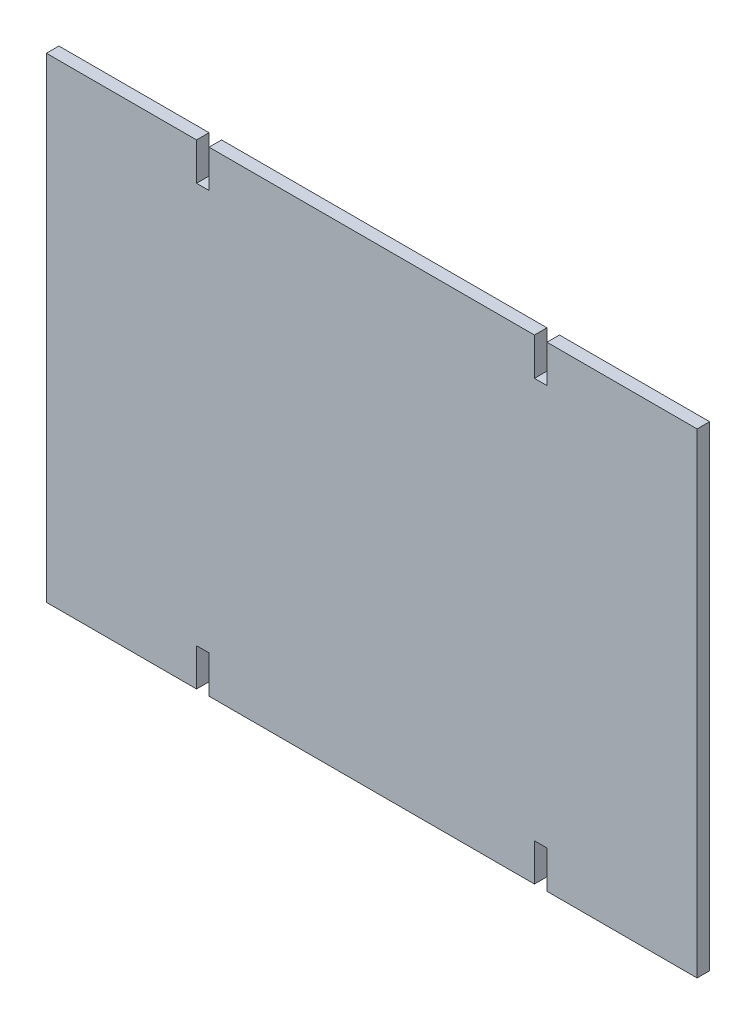
ISO-10303-21;
HEADER;
FILE_DESCRIPTION(('STEP AP214'),'2;1');
FILE_NAME('part.step','',(''),(''),'','','');
FILE_SCHEMA(('AUTOMOTIVE_DESIGN { 1 0 10303 214 1 1 1 1 }'));
ENDSEC;
DATA;
#1=APPLICATION_CONTEXT('core data for automotive mechanical design processes');
#2=APPLICATION_PROTOCOL_DEFINITION('international standard','automotive_design',2000,#1);
#3=PRODUCT_CONTEXT('',#1,'mechanical');
#4=PRODUCT('Part','Part','',(#3));
#5=PRODUCT_RELATED_PRODUCT_CATEGORY('part','',(#4));
#6=PRODUCT_DEFINITION_FORMATION('','',#4);
#7=PRODUCT_DEFINITION_CONTEXT('part definition',#1,'design');
#8=PRODUCT_DEFINITION('design','',#6,#7);
#9=PRODUCT_DEFINITION_SHAPE('','',#8);
#10=(LENGTH_UNIT() NAMED_UNIT(*) SI_UNIT(.MILLI.,.METRE.));
#11=(NAMED_UNIT(*) PLANE_ANGLE_UNIT() SI_UNIT($,.RADIAN.));
#12=(NAMED_UNIT(*) SI_UNIT($,.STERADIAN.) SOLID_ANGLE_UNIT());
#13=UNCERTAINTY_MEASURE_WITH_UNIT(LENGTH_MEASURE(1.E-05),#10,'distance_accuracy_value','');
#14=(GEOMETRIC_REPRESENTATION_CONTEXT(3) GLOBAL_UNCERTAINTY_ASSIGNED_CONTEXT((#13)) GLOBAL_UNIT_ASSIGNED_CONTEXT((#10,
#11,#12)) REPRESENTATION_CONTEXT('',''));
#15=CARTESIAN_POINT('',(0.,0.,0.));
#16=DIRECTION('',(0.,0.,1.));
#17=DIRECTION('',(1.,0.,0.));
#18=AXIS2_PLACEMENT_3D('',#15,#16,#17);
#19=CARTESIAN_POINT('',(0.,-190.,5.));
#20=DIRECTION('',(0.,1.,0.));
#21=DIRECTION('',(0.,0.,1.));
#22=AXIS2_PLACEMENT_3D('',#19,#20,#21);
#23=PLANE('',#22);
#24=DIRECTION('',(1.,0.,0.));
#25=VECTOR('',#24,1.);
#26=CARTESIAN_POINT('',(0.,-190.,5.));
#27=LINE('',#26,#25);
#28=CARTESIAN_POINT('',(200.,-190.,5.));
#29=VERTEX_POINT('',#28);
#30=CARTESIAN_POINT('',(260.,-190.,5.));
#31=VERTEX_POINT('',#30);
#32=EDGE_CURVE('E286',#29,#31,#27,.T.);
#33=ORIENTED_EDGE('',*,*,#32,.F.);
#34=DIRECTION('',(0.,0.,-1.));
#35=VECTOR('',#34,1.);
#36=CARTESIAN_POINT('',(200.,-190.,5.));
#37=LINE('',#36,#35);
#38=CARTESIAN_POINT('',(200.,-190.,0.));
#39=VERTEX_POINT('',#38);
#40=EDGE_CURVE('E227',#29,#39,#37,.T.);
#41=ORIENTED_EDGE('',*,*,#40,.T.);
#42=DIRECTION('',(1.,0.,0.));
#43=VECTOR('',#42,1.);
#44=CARTESIAN_POINT('',(0.,-190.,0.));
#45=LINE('',#44,#43);
#46=CARTESIAN_POINT('',(260.,-190.,0.));
#47=VERTEX_POINT('',#46);
#48=EDGE_CURVE('E300',#39,#47,#45,.T.);
#49=ORIENTED_EDGE('',*,*,#48,.T.);
#50=DIRECTION('',(0.,0.,-1.));
#51=VECTOR('',#50,1.);
#52=CARTESIAN_POINT('',(260.,-190.,5.));
#53=LINE('',#52,#51);
#54=EDGE_CURVE('E44',#31,#47,#53,.T.);
#55=ORIENTED_EDGE('',*,*,#54,.F.);
#56=EDGE_LOOP('',(#33,#41,#49,#55));
#57=FACE_BOUND('',#56,.T.);
#58=ADVANCED_FACE('F36',(#57),#23,.F.);
#59=CARTESIAN_POINT('',(0.,-190.,0.));
#60=VERTEX_POINT('',#59);
#61=CARTESIAN_POINT('',(60.,-190.,0.));
#62=VERTEX_POINT('',#61);
#63=EDGE_CURVE('E301',#60,#62,#45,.T.);
#64=ORIENTED_EDGE('',*,*,#63,.T.);
#65=DIRECTION('',(0.,0.,-1.));
#66=VECTOR('',#65,1.);
#67=CARTESIAN_POINT('',(60.,-190.,5.));
#68=LINE('',#67,#66);
#69=CARTESIAN_POINT('',(60.,-190.,5.));
#70=VERTEX_POINT('',#69);
#71=EDGE_CURVE('E202',#70,#62,#68,.T.);
#72=ORIENTED_EDGE('',*,*,#71,.F.);
#73=CARTESIAN_POINT('',(0.,-190.,5.));
#74=VERTEX_POINT('',#73);
#75=EDGE_CURVE('E193',#74,#70,#27,.T.);
#76=ORIENTED_EDGE('',*,*,#75,.F.);
#77=DIRECTION('',(0.,0.,-1.));
#78=VECTOR('',#77,1.);
#79=CARTESIAN_POINT('',(0.,-190.,5.));
#80=LINE('',#79,#78);
#81=EDGE_CURVE('E11',#74,#60,#80,.T.);
#82=ORIENTED_EDGE('',*,*,#81,.T.);
#83=EDGE_LOOP('',(#64,#72,#76,#82));
#84=FACE_BOUND('',#83,.T.);
#85=ADVANCED_FACE('F353',(#84),#23,.F.);
#86=CARTESIAN_POINT('',(0.,0.,5.));
#87=DIRECTION('',(0.,-1.,0.));
#88=DIRECTION('',(0.,0.,-1.));
#89=AXIS2_PLACEMENT_3D('',#86,#87,#88);
#90=PLANE('',#89);
#91=DIRECTION('',(-1.,0.,0.));
#92=VECTOR('',#91,1.);
#93=CARTESIAN_POINT('',(0.,0.,5.));
#94=LINE('',#93,#92);
#95=CARTESIAN_POINT('',(60.,0.,5.));
#96=VERTEX_POINT('',#95);
#97=CARTESIAN_POINT('',(0.,0.,5.));
#98=VERTEX_POINT('',#97);
#99=EDGE_CURVE('E292',#96,#98,#94,.T.);
#100=ORIENTED_EDGE('',*,*,#99,.F.);
#101=DIRECTION('',(0.,0.,-1.));
#102=VECTOR('',#101,1.);
#103=CARTESIAN_POINT('',(60.,0.,5.));
#104=LINE('',#103,#102);
#105=CARTESIAN_POINT('',(60.,0.,0.));
#106=VERTEX_POINT('',#105);
#107=EDGE_CURVE('E223',#96,#106,#104,.T.);
#108=ORIENTED_EDGE('',*,*,#107,.T.);
#109=DIRECTION('',(-1.,0.,0.));
#110=VECTOR('',#109,1.);
#111=CARTESIAN_POINT('',(0.,0.,0.));
#112=LINE('',#111,#110);
#113=CARTESIAN_POINT('',(0.,0.,0.));
#114=VERTEX_POINT('',#113);
#115=EDGE_CURVE('E307',#106,#114,#112,.T.);
#116=ORIENTED_EDGE('',*,*,#115,.T.);
#117=DIRECTION('',(0.,0.,-1.));
#118=VECTOR('',#117,1.);
#119=CARTESIAN_POINT('',(0.,0.,5.));
#120=LINE('',#119,#118);
#121=EDGE_CURVE('E296',#98,#114,#120,.T.);
#122=ORIENTED_EDGE('',*,*,#121,.F.);
#123=EDGE_LOOP('',(#100,#108,#116,#122));
#124=FACE_BOUND('',#123,.T.);
#125=ADVANCED_FACE('F357',(#124),#90,.F.);
#126=CARTESIAN_POINT('',(260.,0.,0.));
#127=VERTEX_POINT('',#126);
#128=CARTESIAN_POINT('',(200.,0.,0.));
#129=VERTEX_POINT('',#128);
#130=EDGE_CURVE('E287',#127,#129,#112,.T.);
#131=ORIENTED_EDGE('',*,*,#130,.T.);
#132=DIRECTION('',(0.,0.,-1.));
#133=VECTOR('',#132,1.);
#134=CARTESIAN_POINT('',(200.,0.,5.));
#135=LINE('',#134,#133);
#136=CARTESIAN_POINT('',(200.,0.,5.));
#137=VERTEX_POINT('',#136);
#138=EDGE_CURVE('E275',#137,#129,#135,.T.);
#139=ORIENTED_EDGE('',*,*,#138,.F.);
#140=CARTESIAN_POINT('',(260.,0.,5.));
#141=VERTEX_POINT('',#140);
#142=EDGE_CURVE('E293',#141,#137,#94,.T.);
#143=ORIENTED_EDGE('',*,*,#142,.F.);
#144=DIRECTION('',(0.,0.,-1.));
#145=VECTOR('',#144,1.);
#146=CARTESIAN_POINT('',(260.,0.,5.));
#147=LINE('',#146,#145);
#148=EDGE_CURVE('E313',#141,#127,#147,.T.);
#149=ORIENTED_EDGE('',*,*,#148,.T.);
#150=EDGE_LOOP('',(#131,#139,#143,#149));
#151=FACE_BOUND('',#150,.T.);
#152=ADVANCED_FACE('F332',(#151),#90,.F.);
#153=CARTESIAN_POINT('',(0.,0.,5.));
#154=DIRECTION('',(1.,0.,0.));
#155=DIRECTION('',(0.,0.,-1.));
#156=AXIS2_PLACEMENT_3D('',#153,#154,#155);
#157=PLANE('',#156);
#158=DIRECTION('',(0.,-1.,0.));
#159=VECTOR('',#158,1.);
#160=CARTESIAN_POINT('',(0.,0.,0.));
#161=LINE('',#160,#159);
#162=EDGE_CURVE('E277',#114,#60,#161,.T.);
#163=ORIENTED_EDGE('',*,*,#162,.T.);
#164=ORIENTED_EDGE('',*,*,#81,.F.);
#165=DIRECTION('',(0.,-1.,0.));
#166=VECTOR('',#165,1.);
#167=CARTESIAN_POINT('',(0.,0.,5.));
#168=LINE('',#167,#166);
#169=EDGE_CURVE('E284',#98,#74,#168,.T.);
#170=ORIENTED_EDGE('',*,*,#169,.F.);
#171=ORIENTED_EDGE('',*,*,#121,.T.);
#172=EDGE_LOOP('',(#163,#164,#170,#171));
#173=FACE_BOUND('',#172,.T.);
#174=ADVANCED_FACE('F38',(#173),#157,.F.);
#175=CARTESIAN_POINT('',(65.,-190.,0.));
#176=VERTEX_POINT('',#175);
#177=CARTESIAN_POINT('',(195.,-190.,0.));
#178=VERTEX_POINT('',#177);
#179=EDGE_CURVE('E305',#176,#178,#45,.T.);
#180=ORIENTED_EDGE('',*,*,#179,.T.);
#181=DIRECTION('',(0.,0.,-1.));
#182=VECTOR('',#181,1.);
#183=CARTESIAN_POINT('',(195.,-190.,5.));
#184=LINE('',#183,#182);
#185=CARTESIAN_POINT('',(195.,-190.,5.));
#186=VERTEX_POINT('',#185);
#187=EDGE_CURVE('E218',#186,#178,#184,.T.);
#188=ORIENTED_EDGE('',*,*,#187,.F.);
#189=CARTESIAN_POINT('',(65.,-190.,5.));
#190=VERTEX_POINT('',#189);
#191=EDGE_CURVE('E290',#190,#186,#27,.T.);
#192=ORIENTED_EDGE('',*,*,#191,.F.);
#193=DIRECTION('',(0.,0.,-1.));
#194=VECTOR('',#193,1.);
#195=CARTESIAN_POINT('',(65.,-190.,5.));
#196=LINE('',#195,#194);
#197=EDGE_CURVE('E205',#190,#176,#196,.T.);
#198=ORIENTED_EDGE('',*,*,#197,.T.);
#199=EDGE_LOOP('',(#180,#188,#192,#198));
#200=FACE_BOUND('',#199,.T.);
#201=ADVANCED_FACE('F340',(#200),#23,.F.);
#202=CARTESIAN_POINT('',(260.,0.,5.));
#203=DIRECTION('',(-1.,0.,0.));
#204=DIRECTION('',(0.,0.,1.));
#205=AXIS2_PLACEMENT_3D('',#202,#203,#204);
#206=PLANE('',#205);
#207=DIRECTION('',(0.,1.,0.));
#208=VECTOR('',#207,1.);
#209=CARTESIAN_POINT('',(260.,0.,0.));
#210=LINE('',#209,#208);
#211=EDGE_CURVE('E304',#47,#127,#210,.T.);
#212=ORIENTED_EDGE('',*,*,#211,.T.);
#213=ORIENTED_EDGE('',*,*,#148,.F.);
#214=DIRECTION('',(0.,1.,0.));
#215=VECTOR('',#214,1.);
#216=CARTESIAN_POINT('',(260.,0.,5.));
#217=LINE('',#216,#215);
#218=EDGE_CURVE('E289',#31,#141,#217,.T.);
#219=ORIENTED_EDGE('',*,*,#218,.F.);
#220=ORIENTED_EDGE('',*,*,#54,.T.);
#221=EDGE_LOOP('',(#212,#213,#219,#220));
#222=FACE_BOUND('',#221,.T.);
#223=ADVANCED_FACE('F320',(#222),#206,.F.);
#224=CARTESIAN_POINT('',(195.,0.,0.));
#225=VERTEX_POINT('',#224);
#226=CARTESIAN_POINT('',(65.,0.,0.));
#227=VERTEX_POINT('',#226);
#228=EDGE_CURVE('E310',#225,#227,#112,.T.);
#229=ORIENTED_EDGE('',*,*,#228,.T.);
#230=DIRECTION('',(0.,0.,-1.));
#231=VECTOR('',#230,1.);
#232=CARTESIAN_POINT('',(65.,0.,5.));
#233=LINE('',#232,#231);
#234=CARTESIAN_POINT('',(65.,0.,5.));
#235=VERTEX_POINT('',#234);
#236=EDGE_CURVE('E245',#235,#227,#233,.T.);
#237=ORIENTED_EDGE('',*,*,#236,.F.);
#238=CARTESIAN_POINT('',(195.,0.,5.));
#239=VERTEX_POINT('',#238);
#240=EDGE_CURVE('E297',#239,#235,#94,.T.);
#241=ORIENTED_EDGE('',*,*,#240,.F.);
#242=DIRECTION('',(0.,0.,-1.));
#243=VECTOR('',#242,1.);
#244=CARTESIAN_POINT('',(195.,0.,5.));
#245=LINE('',#244,#243);
#246=EDGE_CURVE('E278',#239,#225,#245,.T.);
#247=ORIENTED_EDGE('',*,*,#246,.T.);
#248=EDGE_LOOP('',(#229,#237,#241,#247));
#249=FACE_BOUND('',#248,.T.);
#250=ADVANCED_FACE('F365',(#249),#90,.F.);
#251=CARTESIAN_POINT('',(0.,0.,5.));
#252=DIRECTION('',(0.,0.,1.));
#253=DIRECTION('',(1.,0.,0.));
#254=AXIS2_PLACEMENT_3D('',#251,#252,#253);
#255=PLANE('',#254);
#256=DIRECTION('',(0.,-1.,0.));
#257=VECTOR('',#256,1.);
#258=CARTESIAN_POINT('',(200.,-190.,5.));
#259=LINE('',#258,#257);
#260=CARTESIAN_POINT('',(200.,-175.,5.));
#261=VERTEX_POINT('',#260);
#262=EDGE_CURVE('E216',#261,#29,#259,.T.);
#263=ORIENTED_EDGE('',*,*,#262,.T.);
#264=ORIENTED_EDGE('',*,*,#32,.T.);
#265=ORIENTED_EDGE('',*,*,#218,.T.);
#266=ORIENTED_EDGE('',*,*,#142,.T.);
#267=DIRECTION('',(0.,-1.,0.));
#268=VECTOR('',#267,1.);
#269=CARTESIAN_POINT('',(200.,0.,5.));
#270=LINE('',#269,#268);
#271=CARTESIAN_POINT('',(200.,-15.,5.));
#272=VERTEX_POINT('',#271);
#273=EDGE_CURVE('E259',#137,#272,#270,.T.);
#274=ORIENTED_EDGE('',*,*,#273,.T.);
#275=DIRECTION('',(-1.,0.,0.));
#276=VECTOR('',#275,1.);
#277=CARTESIAN_POINT('',(200.,-15.,5.));
#278=LINE('',#277,#276);
#279=CARTESIAN_POINT('',(195.,-15.,5.));
#280=VERTEX_POINT('',#279);
#281=EDGE_CURVE('E262',#272,#280,#278,.T.);
#282=ORIENTED_EDGE('',*,*,#281,.T.);
#283=DIRECTION('',(0.,1.,0.));
#284=VECTOR('',#283,1.);
#285=CARTESIAN_POINT('',(195.,0.,5.));
#286=LINE('',#285,#284);
#287=EDGE_CURVE('E266',#280,#239,#286,.T.);
#288=ORIENTED_EDGE('',*,*,#287,.T.);
#289=ORIENTED_EDGE('',*,*,#240,.T.);
#290=DIRECTION('',(0.,-1.,0.));
#291=VECTOR('',#290,1.);
#292=CARTESIAN_POINT('',(65.,0.,5.));
#293=LINE('',#292,#291);
#294=CARTESIAN_POINT('',(65.,-15.,5.));
#295=VERTEX_POINT('',#294);
#296=EDGE_CURVE('E235',#235,#295,#293,.T.);
#297=ORIENTED_EDGE('',*,*,#296,.T.);
#298=DIRECTION('',(-1.,0.,0.));
#299=VECTOR('',#298,1.);
#300=CARTESIAN_POINT('',(60.,-15.,5.));
#301=LINE('',#300,#299);
#302=CARTESIAN_POINT('',(60.,-15.,5.));
#303=VERTEX_POINT('',#302);
#304=EDGE_CURVE('E238',#295,#303,#301,.T.);
#305=ORIENTED_EDGE('',*,*,#304,.T.);
#306=DIRECTION('',(0.,1.,0.));
#307=VECTOR('',#306,1.);
#308=CARTESIAN_POINT('',(60.,0.,5.));
#309=LINE('',#308,#307);
#310=EDGE_CURVE('E242',#303,#96,#309,.T.);
#311=ORIENTED_EDGE('',*,*,#310,.T.);
#312=ORIENTED_EDGE('',*,*,#99,.T.);
#313=ORIENTED_EDGE('',*,*,#169,.T.);
#314=ORIENTED_EDGE('',*,*,#75,.T.);
#315=DIRECTION('',(0.,1.,0.));
#316=VECTOR('',#315,1.);
#317=CARTESIAN_POINT('',(60.,-190.,5.));
#318=LINE('',#317,#316);
#319=CARTESIAN_POINT('',(60.,-175.,5.));
#320=VERTEX_POINT('',#319);
#321=EDGE_CURVE('E174',#70,#320,#318,.T.);
#322=ORIENTED_EDGE('',*,*,#321,.T.);
#323=DIRECTION('',(1.,0.,0.));
#324=VECTOR('',#323,1.);
#325=CARTESIAN_POINT('',(60.,-175.,5.));
#326=LINE('',#325,#324);
#327=CARTESIAN_POINT('',(65.,-175.,5.));
#328=VERTEX_POINT('',#327);
#329=EDGE_CURVE('E183',#320,#328,#326,.T.);
#330=ORIENTED_EDGE('',*,*,#329,.T.);
#331=DIRECTION('',(0.,-1.,0.));
#332=VECTOR('',#331,1.);
#333=CARTESIAN_POINT('',(65.,-190.,5.));
#334=LINE('',#333,#332);
#335=EDGE_CURVE('E180',#328,#190,#334,.T.);
#336=ORIENTED_EDGE('',*,*,#335,.T.);
#337=ORIENTED_EDGE('',*,*,#191,.T.);
#338=DIRECTION('',(0.,1.,0.));
#339=VECTOR('',#338,1.);
#340=CARTESIAN_POINT('',(195.,-190.,5.));
#341=LINE('',#340,#339);
#342=CARTESIAN_POINT('',(195.,-175.,5.));
#343=VERTEX_POINT('',#342);
#344=EDGE_CURVE('E209',#186,#343,#341,.T.);
#345=ORIENTED_EDGE('',*,*,#344,.T.);
#346=DIRECTION('',(1.,0.,0.));
#347=VECTOR('',#346,1.);
#348=CARTESIAN_POINT('',(200.,-175.,5.));
#349=LINE('',#348,#347);
#350=EDGE_CURVE('E212',#343,#261,#349,.T.);
#351=ORIENTED_EDGE('',*,*,#350,.T.);
#352=EDGE_LOOP('',(#263,#264,#265,#266,#274,#282,#288,#289,#297,#305,#311,#312,#313,#314,#322,
#330,#336,#337,#345,#351));
#353=FACE_BOUND('',#352,.T.);
#354=ADVANCED_FACE('F191',(#353),#255,.T.);
#355=CARTESIAN_POINT('',(0.,0.,0.));
#356=DIRECTION('',(0.,0.,1.));
#357=DIRECTION('',(1.,0.,0.));
#358=AXIS2_PLACEMENT_3D('',#355,#356,#357);
#359=PLANE('',#358);
#360=ORIENTED_EDGE('',*,*,#48,.F.);
#361=DIRECTION('',(0.,-1.,0.));
#362=VECTOR('',#361,1.);
#363=CARTESIAN_POINT('',(200.,-190.,0.));
#364=LINE('',#363,#362);
#365=CARTESIAN_POINT('',(200.,-175.,0.));
#366=VERTEX_POINT('',#365);
#367=EDGE_CURVE('E213',#366,#39,#364,.T.);
#368=ORIENTED_EDGE('',*,*,#367,.F.);
#369=DIRECTION('',(1.,0.,0.));
#370=VECTOR('',#369,1.);
#371=CARTESIAN_POINT('',(200.,-175.,0.));
#372=LINE('',#371,#370);
#373=CARTESIAN_POINT('',(195.,-175.,0.));
#374=VERTEX_POINT('',#373);
#375=EDGE_CURVE('E222',#374,#366,#372,.T.);
#376=ORIENTED_EDGE('',*,*,#375,.F.);
#377=DIRECTION('',(0.,1.,0.));
#378=VECTOR('',#377,1.);
#379=CARTESIAN_POINT('',(195.,-190.,0.));
#380=LINE('',#379,#378);
#381=EDGE_CURVE('E219',#178,#374,#380,.T.);
#382=ORIENTED_EDGE('',*,*,#381,.F.);
#383=ORIENTED_EDGE('',*,*,#179,.F.);
#384=DIRECTION('',(0.,-1.,0.));
#385=VECTOR('',#384,1.);
#386=CARTESIAN_POINT('',(65.,-190.,0.));
#387=LINE('',#386,#385);
#388=CARTESIAN_POINT('',(65.,-175.,0.));
#389=VERTEX_POINT('',#388);
#390=EDGE_CURVE('E194',#389,#176,#387,.T.);
#391=ORIENTED_EDGE('',*,*,#390,.F.);
#392=DIRECTION('',(1.,0.,0.));
#393=VECTOR('',#392,1.);
#394=CARTESIAN_POINT('',(60.,-175.,0.));
#395=LINE('',#394,#393);
#396=CARTESIAN_POINT('',(60.,-175.,0.));
#397=VERTEX_POINT('',#396);
#398=EDGE_CURVE('E196',#397,#389,#395,.T.);
#399=ORIENTED_EDGE('',*,*,#398,.F.);
#400=DIRECTION('',(0.,1.,0.));
#401=VECTOR('',#400,1.);
#402=CARTESIAN_POINT('',(60.,-190.,0.));
#403=LINE('',#402,#401);
#404=EDGE_CURVE('E51',#62,#397,#403,.T.);
#405=ORIENTED_EDGE('',*,*,#404,.F.);
#406=ORIENTED_EDGE('',*,*,#63,.F.);
#407=ORIENTED_EDGE('',*,*,#162,.F.);
#408=ORIENTED_EDGE('',*,*,#115,.F.);
#409=DIRECTION('',(0.,1.,0.));
#410=VECTOR('',#409,1.);
#411=CARTESIAN_POINT('',(60.,0.,0.));
#412=LINE('',#411,#410);
#413=CARTESIAN_POINT('',(60.,-15.,0.));
#414=VERTEX_POINT('',#413);
#415=EDGE_CURVE('E239',#414,#106,#412,.T.);
#416=ORIENTED_EDGE('',*,*,#415,.F.);
#417=DIRECTION('',(-1.,0.,0.));
#418=VECTOR('',#417,1.);
#419=CARTESIAN_POINT('',(60.,-15.,0.));
#420=LINE('',#419,#418);
#421=CARTESIAN_POINT('',(65.,-15.,0.));
#422=VERTEX_POINT('',#421);
#423=EDGE_CURVE('E248',#422,#414,#420,.T.);
#424=ORIENTED_EDGE('',*,*,#423,.F.);
#425=DIRECTION('',(0.,-1.,0.));
#426=VECTOR('',#425,1.);
#427=CARTESIAN_POINT('',(65.,0.,0.));
#428=LINE('',#427,#426);
#429=EDGE_CURVE('E204',#227,#422,#428,.T.);
#430=ORIENTED_EDGE('',*,*,#429,.F.);
#431=ORIENTED_EDGE('',*,*,#228,.F.);
#432=DIRECTION('',(0.,1.,0.));
#433=VECTOR('',#432,1.);
#434=CARTESIAN_POINT('',(195.,0.,0.));
#435=LINE('',#434,#433);
#436=CARTESIAN_POINT('',(195.,-15.,0.));
#437=VERTEX_POINT('',#436);
#438=EDGE_CURVE('E263',#437,#225,#435,.T.);
#439=ORIENTED_EDGE('',*,*,#438,.F.);
#440=DIRECTION('',(-1.,0.,0.));
#441=VECTOR('',#440,1.);
#442=CARTESIAN_POINT('',(200.,-15.,0.));
#443=LINE('',#442,#441);
#444=CARTESIAN_POINT('',(200.,-15.,0.));
#445=VERTEX_POINT('',#444);
#446=EDGE_CURVE('E271',#445,#437,#443,.T.);
#447=ORIENTED_EDGE('',*,*,#446,.F.);
#448=DIRECTION('',(0.,-1.,0.));
#449=VECTOR('',#448,1.);
#450=CARTESIAN_POINT('',(200.,0.,0.));
#451=LINE('',#450,#449);
#452=EDGE_CURVE('E59',#129,#445,#451,.T.);
#453=ORIENTED_EDGE('',*,*,#452,.F.);
#454=ORIENTED_EDGE('',*,*,#130,.F.);
#455=ORIENTED_EDGE('',*,*,#211,.F.);
#456=EDGE_LOOP('',(#360,#368,#376,#382,#383,#391,#399,#405,#406,#407,#408,#416,#424,#430,#431,
#439,#447,#453,#454,#455));
#457=FACE_BOUND('',#456,.T.);
#458=ADVANCED_FACE('F327',(#457),#359,.F.);
#459=CARTESIAN_POINT('',(200.,0.,5.));
#460=DIRECTION('',(1.,0.,0.));
#461=DIRECTION('',(0.,0.,-1.));
#462=AXIS2_PLACEMENT_3D('',#459,#460,#461);
#463=PLANE('',#462);
#464=ORIENTED_EDGE('',*,*,#452,.T.);
#465=DIRECTION('',(0.,0.,-1.));
#466=VECTOR('',#465,1.);
#467=CARTESIAN_POINT('',(200.,-15.,5.));
#468=LINE('',#467,#466);
#469=EDGE_CURVE('E269',#272,#445,#468,.T.);
#470=ORIENTED_EDGE('',*,*,#469,.F.);
#471=ORIENTED_EDGE('',*,*,#273,.F.);
#472=ORIENTED_EDGE('',*,*,#138,.T.);
#473=EDGE_LOOP('',(#464,#470,#471,#472));
#474=FACE_BOUND('',#473,.T.);
#475=ADVANCED_FACE('F398',(#474),#463,.F.);
#476=CARTESIAN_POINT('',(195.,0.,5.));
#477=DIRECTION('',(-1.,0.,0.));
#478=DIRECTION('',(0.,0.,1.));
#479=AXIS2_PLACEMENT_3D('',#476,#477,#478);
#480=PLANE('',#479);
#481=ORIENTED_EDGE('',*,*,#438,.T.);
#482=ORIENTED_EDGE('',*,*,#246,.F.);
#483=ORIENTED_EDGE('',*,*,#287,.F.);
#484=DIRECTION('',(0.,0.,-1.));
#485=VECTOR('',#484,1.);
#486=CARTESIAN_POINT('',(195.,-15.,5.));
#487=LINE('',#486,#485);
#488=EDGE_CURVE('E281',#280,#437,#487,.T.);
#489=ORIENTED_EDGE('',*,*,#488,.T.);
#490=EDGE_LOOP('',(#481,#482,#483,#489));
#491=FACE_BOUND('',#490,.T.);
#492=ADVANCED_FACE('F395',(#491),#480,.F.);
#493=CARTESIAN_POINT('',(200.,-15.,5.));
#494=DIRECTION('',(0.,-1.,0.));
#495=DIRECTION('',(0.,0.,-1.));
#496=AXIS2_PLACEMENT_3D('',#493,#494,#495);
#497=PLANE('',#496);
#498=ORIENTED_EDGE('',*,*,#446,.T.);
#499=ORIENTED_EDGE('',*,*,#488,.F.);
#500=ORIENTED_EDGE('',*,*,#281,.F.);
#501=ORIENTED_EDGE('',*,*,#469,.T.);
#502=EDGE_LOOP('',(#498,#499,#500,#501));
#503=FACE_BOUND('',#502,.T.);
#504=ADVANCED_FACE('F397',(#503),#497,.F.);
#505=CARTESIAN_POINT('',(60.,-190.,5.));
#506=DIRECTION('',(-1.,0.,0.));
#507=DIRECTION('',(0.,0.,1.));
#508=AXIS2_PLACEMENT_3D('',#505,#506,#507);
#509=PLANE('',#508);
#510=ORIENTED_EDGE('',*,*,#404,.T.);
#511=DIRECTION('',(0.,0.,-1.));
#512=VECTOR('',#511,1.);
#513=CARTESIAN_POINT('',(60.,-175.,5.));
#514=LINE('',#513,#512);
#515=EDGE_CURVE('E170',#320,#397,#514,.T.);
#516=ORIENTED_EDGE('',*,*,#515,.F.);
#517=ORIENTED_EDGE('',*,*,#321,.F.);
#518=ORIENTED_EDGE('',*,*,#71,.T.);
#519=EDGE_LOOP('',(#510,#516,#517,#518));
#520=FACE_BOUND('',#519,.T.);
#521=ADVANCED_FACE('F172',(#520),#509,.F.);
#522=CARTESIAN_POINT('',(65.,-190.,5.));
#523=DIRECTION('',(1.,0.,0.));
#524=DIRECTION('',(0.,0.,-1.));
#525=AXIS2_PLACEMENT_3D('',#522,#523,#524);
#526=PLANE('',#525);
#527=ORIENTED_EDGE('',*,*,#390,.T.);
#528=ORIENTED_EDGE('',*,*,#197,.F.);
#529=ORIENTED_EDGE('',*,*,#335,.F.);
#530=DIRECTION('',(0.,0.,-1.));
#531=VECTOR('',#530,1.);
#532=CARTESIAN_POINT('',(65.,-175.,5.));
#533=LINE('',#532,#531);
#534=EDGE_CURVE('E179',#328,#389,#533,.T.);
#535=ORIENTED_EDGE('',*,*,#534,.T.);
#536=EDGE_LOOP('',(#527,#528,#529,#535));
#537=FACE_BOUND('',#536,.T.);
#538=ADVANCED_FACE('F471',(#537),#526,.F.);
#539=CARTESIAN_POINT('',(60.,-175.,5.));
#540=DIRECTION('',(0.,1.,0.));
#541=DIRECTION('',(0.,0.,1.));
#542=AXIS2_PLACEMENT_3D('',#539,#540,#541);
#543=PLANE('',#542);
#544=ORIENTED_EDGE('',*,*,#398,.T.);
#545=ORIENTED_EDGE('',*,*,#534,.F.);
#546=ORIENTED_EDGE('',*,*,#329,.F.);
#547=ORIENTED_EDGE('',*,*,#515,.T.);
#548=EDGE_LOOP('',(#544,#545,#546,#547));
#549=FACE_BOUND('',#548,.T.);
#550=ADVANCED_FACE('F184',(#549),#543,.F.);
#551=CARTESIAN_POINT('',(60.,0.,5.));
#552=DIRECTION('',(-1.,0.,0.));
#553=DIRECTION('',(0.,0.,1.));
#554=AXIS2_PLACEMENT_3D('',#551,#552,#553);
#555=PLANE('',#554);
#556=ORIENTED_EDGE('',*,*,#415,.T.);
#557=ORIENTED_EDGE('',*,*,#107,.F.);
#558=ORIENTED_EDGE('',*,*,#310,.F.);
#559=DIRECTION('',(0.,0.,-1.));
#560=VECTOR('',#559,1.);
#561=CARTESIAN_POINT('',(60.,-15.,5.));
#562=LINE('',#561,#560);
#563=EDGE_CURVE('E254',#303,#414,#562,.T.);
#564=ORIENTED_EDGE('',*,*,#563,.T.);
#565=EDGE_LOOP('',(#556,#557,#558,#564));
#566=FACE_BOUND('',#565,.T.);
#567=ADVANCED_FACE('F489',(#566),#555,.F.);
#568=CARTESIAN_POINT('',(60.,-15.,5.));
#569=DIRECTION('',(0.,-1.,0.));
#570=DIRECTION('',(0.,0.,-1.));
#571=AXIS2_PLACEMENT_3D('',#568,#569,#570);
#572=PLANE('',#571);
#573=ORIENTED_EDGE('',*,*,#423,.T.);
#574=ORIENTED_EDGE('',*,*,#563,.F.);
#575=ORIENTED_EDGE('',*,*,#304,.F.);
#576=DIRECTION('',(0.,0.,-1.));
#577=VECTOR('',#576,1.);
#578=CARTESIAN_POINT('',(65.,-15.,5.));
#579=LINE('',#578,#577);
#580=EDGE_CURVE('E256',#295,#422,#579,.T.);
#581=ORIENTED_EDGE('',*,*,#580,.T.);
#582=EDGE_LOOP('',(#573,#574,#575,#581));
#583=FACE_BOUND('',#582,.T.);
#584=ADVANCED_FACE('F498',(#583),#572,.F.);
#585=CARTESIAN_POINT('',(65.,0.,5.));
#586=DIRECTION('',(1.,0.,0.));
#587=DIRECTION('',(0.,0.,-1.));
#588=AXIS2_PLACEMENT_3D('',#585,#586,#587);
#589=PLANE('',#588);
#590=ORIENTED_EDGE('',*,*,#429,.T.);
#591=ORIENTED_EDGE('',*,*,#580,.F.);
#592=ORIENTED_EDGE('',*,*,#296,.F.);
#593=ORIENTED_EDGE('',*,*,#236,.T.);
#594=EDGE_LOOP('',(#590,#591,#592,#593));
#595=FACE_BOUND('',#594,.T.);
#596=ADVANCED_FACE('F390',(#595),#589,.F.);
#597=CARTESIAN_POINT('',(200.,-190.,5.));
#598=DIRECTION('',(1.,0.,0.));
#599=DIRECTION('',(0.,0.,-1.));
#600=AXIS2_PLACEMENT_3D('',#597,#598,#599);
#601=PLANE('',#600);
#602=ORIENTED_EDGE('',*,*,#367,.T.);
#603=ORIENTED_EDGE('',*,*,#40,.F.);
#604=ORIENTED_EDGE('',*,*,#262,.F.);
#605=DIRECTION('',(0.,0.,-1.));
#606=VECTOR('',#605,1.);
#607=CARTESIAN_POINT('',(200.,-175.,5.));
#608=LINE('',#607,#606);
#609=EDGE_CURVE('E230',#261,#366,#608,.T.);
#610=ORIENTED_EDGE('',*,*,#609,.T.);
#611=EDGE_LOOP('',(#602,#603,#604,#610));
#612=FACE_BOUND('',#611,.T.);
#613=ADVANCED_FACE('F351',(#612),#601,.F.);
#614=CARTESIAN_POINT('',(200.,-175.,5.));
#615=DIRECTION('',(0.,1.,0.));
#616=DIRECTION('',(0.,0.,1.));
#617=AXIS2_PLACEMENT_3D('',#614,#615,#616);
#618=PLANE('',#617);
#619=ORIENTED_EDGE('',*,*,#375,.T.);
#620=ORIENTED_EDGE('',*,*,#609,.F.);
#621=ORIENTED_EDGE('',*,*,#350,.F.);
#622=DIRECTION('',(0.,0.,-1.));
#623=VECTOR('',#622,1.);
#624=CARTESIAN_POINT('',(195.,-175.,5.));
#625=LINE('',#624,#623);
#626=EDGE_CURVE('E232',#343,#374,#625,.T.);
#627=ORIENTED_EDGE('',*,*,#626,.T.);
#628=EDGE_LOOP('',(#619,#620,#621,#627));
#629=FACE_BOUND('',#628,.T.);
#630=ADVANCED_FACE('F348',(#629),#618,.F.);
#631=CARTESIAN_POINT('',(195.,-190.,5.));
#632=DIRECTION('',(-1.,0.,0.));
#633=DIRECTION('',(0.,0.,1.));
#634=AXIS2_PLACEMENT_3D('',#631,#632,#633);
#635=PLANE('',#634);
#636=ORIENTED_EDGE('',*,*,#381,.T.);
#637=ORIENTED_EDGE('',*,*,#626,.F.);
#638=ORIENTED_EDGE('',*,*,#344,.F.);
#639=ORIENTED_EDGE('',*,*,#187,.T.);
#640=EDGE_LOOP('',(#636,#637,#638,#639));
#641=FACE_BOUND('',#640,.T.);
#642=ADVANCED_FACE('F344',(#641),#635,.F.);
#643=CLOSED_SHELL('',(#58,#85,#125,#152,#174,#201,#223,#250,#354,#458,#475,#492,#504,#521,#538,
#550,#567,#584,#596,#613,#630,#642));
#644=MANIFOLD_SOLID_BREP('B2',#643);
#645=ADVANCED_BREP_SHAPE_REPRESENTATION('',(#18,#644),#14);
#646=SHAPE_DEFINITION_REPRESENTATION(#9,#645);
ENDSEC;
END-ISO-10303-21;
